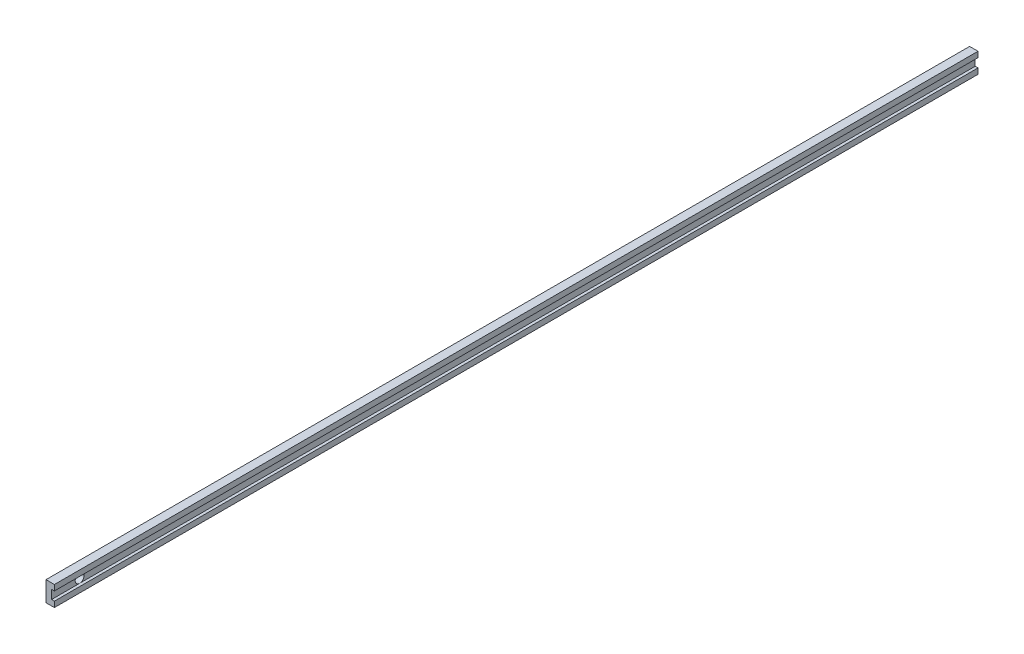
ISO-10303-21;
HEADER;
FILE_DESCRIPTION(('STEP AP214'),'2;1');
FILE_NAME('part.step','',(''),(''),'','','');
FILE_SCHEMA(('AUTOMOTIVE_DESIGN { 1 0 10303 214 1 1 1 1 }'));
ENDSEC;
DATA;
#1=APPLICATION_CONTEXT('core data for automotive mechanical design processes');
#2=APPLICATION_PROTOCOL_DEFINITION('international standard','automotive_design',2000,#1);
#3=PRODUCT_CONTEXT('',#1,'mechanical');
#4=PRODUCT('Part','Part','',(#3));
#5=PRODUCT_RELATED_PRODUCT_CATEGORY('part','',(#4));
#6=PRODUCT_DEFINITION_FORMATION('','',#4);
#7=PRODUCT_DEFINITION_CONTEXT('part definition',#1,'design');
#8=PRODUCT_DEFINITION('design','',#6,#7);
#9=PRODUCT_DEFINITION_SHAPE('','',#8);
#10=(LENGTH_UNIT() NAMED_UNIT(*) SI_UNIT(.MILLI.,.METRE.));
#11=(NAMED_UNIT(*) PLANE_ANGLE_UNIT() SI_UNIT($,.RADIAN.));
#12=(NAMED_UNIT(*) SI_UNIT($,.STERADIAN.) SOLID_ANGLE_UNIT());
#13=UNCERTAINTY_MEASURE_WITH_UNIT(LENGTH_MEASURE(1.E-05),#10,'distance_accuracy_value','');
#14=(GEOMETRIC_REPRESENTATION_CONTEXT(3) GLOBAL_UNCERTAINTY_ASSIGNED_CONTEXT((#13)) GLOBAL_UNIT_ASSIGNED_CONTEXT((#10,
#11,#12)) REPRESENTATION_CONTEXT('',''));
#15=CARTESIAN_POINT('',(0.,0.,0.));
#16=DIRECTION('',(0.,0.,1.));
#17=DIRECTION('',(1.,0.,0.));
#18=AXIS2_PLACEMENT_3D('',#15,#16,#17);
#19=CARTESIAN_POINT('',(0.,-5.31875445685762,838.2));
#20=DIRECTION('',(-1.,0.,0.));
#21=DIRECTION('',(0.,-1.,0.));
#22=AXIS2_PLACEMENT_3D('',#19,#20,#21);
#23=PLANE('',#22);
#24=DIRECTION('',(0.,0.,-1.));
#25=VECTOR('',#24,1.);
#26=CARTESIAN_POINT('',(0.,-13.3187544568576,838.2));
#27=LINE('',#26,#25);
#28=CARTESIAN_POINT('',(0.,-13.3187544568576,838.2));
#29=VERTEX_POINT('',#28);
#30=CARTESIAN_POINT('',(0.,-13.3187544568576,812.8));
#31=VERTEX_POINT('',#30);
#32=EDGE_CURVE('E131',#29,#31,#27,.T.);
#33=ORIENTED_EDGE('',*,*,#32,.T.);
#34=CARTESIAN_POINT('',(0.,-9.31875445685763,812.8));
#35=DIRECTION('',(-1.,0.,0.));
#36=DIRECTION('',(0.,-1.,0.));
#37=AXIS2_PLACEMENT_3D('',#34,#35,#36);
#38=CIRCLE('',#37,3.99999999999998);
#39=CARTESIAN_POINT('',(0.,-5.31875445685762,812.8));
#40=VERTEX_POINT('',#39);
#41=EDGE_CURVE('E11',#31,#40,#38,.T.);
#42=ORIENTED_EDGE('',*,*,#41,.T.);
#43=DIRECTION('',(0.,0.,-1.));
#44=VECTOR('',#43,1.);
#45=CARTESIAN_POINT('',(0.,-5.31875445685762,838.2));
#46=LINE('',#45,#44);
#47=CARTESIAN_POINT('',(0.,-5.31875445685762,838.2));
#48=VERTEX_POINT('',#47);
#49=EDGE_CURVE('E157',#48,#40,#46,.T.);
#50=ORIENTED_EDGE('',*,*,#49,.F.);
#51=DIRECTION('',(0.,1.,0.));
#52=VECTOR('',#51,1.);
#53=CARTESIAN_POINT('',(0.,-5.31875445685762,838.2));
#54=LINE('',#53,#52);
#55=EDGE_CURVE('E54',#29,#48,#54,.T.);
#56=ORIENTED_EDGE('',*,*,#55,.F.);
#57=EDGE_LOOP('',(#33,#42,#50,#56));
#58=FACE_BOUND('',#57,.T.);
#59=ADVANCED_FACE('F33',(#58),#23,.F.);
#60=CARTESIAN_POINT('',(2.54,-5.31875445685762,838.2));
#61=DIRECTION('',(0.,1.,0.));
#62=DIRECTION('',(0.,0.,1.));
#63=AXIS2_PLACEMENT_3D('',#60,#61,#62);
#64=PLANE('',#63);
#65=DIRECTION('',(1.,0.,0.));
#66=VECTOR('',#65,1.);
#67=CARTESIAN_POINT('',(2.54,-5.31875445685762,0.));
#68=LINE('',#67,#66);
#69=CARTESIAN_POINT('',(0.,-5.31875445685762,0.));
#70=VERTEX_POINT('',#69);
#71=CARTESIAN_POINT('',(2.54,-5.31875445685762,0.));
#72=VERTEX_POINT('',#71);
#73=EDGE_CURVE('E140',#70,#72,#68,.T.);
#74=ORIENTED_EDGE('',*,*,#73,.T.);
#75=DIRECTION('',(0.,0.,-1.));
#76=VECTOR('',#75,1.);
#77=CARTESIAN_POINT('',(2.54,-5.31875445685762,838.2));
#78=LINE('',#77,#76);
#79=CARTESIAN_POINT('',(2.54,-5.31875445685762,838.2));
#80=VERTEX_POINT('',#79);
#81=EDGE_CURVE('E170',#80,#72,#78,.T.);
#82=ORIENTED_EDGE('',*,*,#81,.F.);
#83=DIRECTION('',(1.,0.,0.));
#84=VECTOR('',#83,1.);
#85=CARTESIAN_POINT('',(2.54,-5.31875445685762,838.2));
#86=LINE('',#85,#84);
#87=EDGE_CURVE('E156',#48,#80,#86,.T.);
#88=ORIENTED_EDGE('',*,*,#87,.F.);
#89=ORIENTED_EDGE('',*,*,#49,.T.);
#90=EDGE_CURVE('E88',#40,#70,#46,.T.);
#91=ORIENTED_EDGE('',*,*,#90,.T.);
#92=EDGE_LOOP('',(#74,#82,#88,#89,#91));
#93=FACE_BOUND('',#92,.T.);
#94=ADVANCED_FACE('F35',(#93),#64,.F.);
#95=CARTESIAN_POINT('',(2.54,-0.238754456857623,838.2));
#96=DIRECTION('',(-1.,0.,0.));
#97=DIRECTION('',(0.,-1.,0.));
#98=AXIS2_PLACEMENT_3D('',#95,#96,#97);
#99=PLANE('',#98);
#100=DIRECTION('',(0.,1.,0.));
#101=VECTOR('',#100,1.);
#102=CARTESIAN_POINT('',(2.54,-0.238754456857623,0.));
#103=LINE('',#102,#101);
#104=CARTESIAN_POINT('',(2.54,-0.238754456857623,0.));
#105=VERTEX_POINT('',#104);
#106=EDGE_CURVE('E142',#72,#105,#103,.T.);
#107=ORIENTED_EDGE('',*,*,#106,.T.);
#108=DIRECTION('',(0.,0.,-1.));
#109=VECTOR('',#108,1.);
#110=CARTESIAN_POINT('',(2.54,-0.238754456857623,838.2));
#111=LINE('',#110,#109);
#112=CARTESIAN_POINT('',(2.54,-0.238754456857623,838.2));
#113=VERTEX_POINT('',#112);
#114=EDGE_CURVE('E168',#113,#105,#111,.T.);
#115=ORIENTED_EDGE('',*,*,#114,.F.);
#116=DIRECTION('',(0.,1.,0.));
#117=VECTOR('',#116,1.);
#118=CARTESIAN_POINT('',(2.54,-0.238754456857623,838.2));
#119=LINE('',#118,#117);
#120=EDGE_CURVE('E96',#80,#113,#119,.T.);
#121=ORIENTED_EDGE('',*,*,#120,.F.);
#122=ORIENTED_EDGE('',*,*,#81,.T.);
#123=EDGE_LOOP('',(#107,#115,#121,#122));
#124=FACE_BOUND('',#123,.T.);
#125=ADVANCED_FACE('F199',(#124),#99,.F.);
#126=CARTESIAN_POINT('',(-5.08,-0.23875445685762,838.2));
#127=DIRECTION('',(0.,-1.,0.));
#128=DIRECTION('',(1.,0.,0.));
#129=AXIS2_PLACEMENT_3D('',#126,#127,#128);
#130=PLANE('',#129);
#131=DIRECTION('',(-1.,0.,0.));
#132=VECTOR('',#131,1.);
#133=CARTESIAN_POINT('',(-5.08,-0.23875445685762,0.));
#134=LINE('',#133,#132);
#135=CARTESIAN_POINT('',(-5.08,-0.23875445685762,0.));
#136=VERTEX_POINT('',#135);
#137=EDGE_CURVE('E145',#105,#136,#134,.T.);
#138=ORIENTED_EDGE('',*,*,#137,.T.);
#139=DIRECTION('',(0.,0.,-1.));
#140=VECTOR('',#139,1.);
#141=CARTESIAN_POINT('',(-5.08,-0.23875445685762,838.2));
#142=LINE('',#141,#140);
#143=CARTESIAN_POINT('',(-5.08,-0.23875445685762,838.2));
#144=VERTEX_POINT('',#143);
#145=EDGE_CURVE('E165',#144,#136,#142,.T.);
#146=ORIENTED_EDGE('',*,*,#145,.F.);
#147=DIRECTION('',(-1.,0.,0.));
#148=VECTOR('',#147,1.);
#149=CARTESIAN_POINT('',(-5.08,-0.23875445685762,838.2));
#150=LINE('',#149,#148);
#151=EDGE_CURVE('E179',#113,#144,#150,.T.);
#152=ORIENTED_EDGE('',*,*,#151,.F.);
#153=ORIENTED_EDGE('',*,*,#114,.T.);
#154=EDGE_LOOP('',(#138,#146,#152,#153));
#155=FACE_BOUND('',#154,.T.);
#156=ADVANCED_FACE('F201',(#155),#130,.F.);
#157=CARTESIAN_POINT('',(-5.08,-18.3987544568576,838.2));
#158=DIRECTION('',(1.,0.,0.));
#159=DIRECTION('',(0.,1.,0.));
#160=AXIS2_PLACEMENT_3D('',#157,#158,#159);
#161=PLANE('',#160);
#162=CARTESIAN_POINT('',(-5.08,-9.31875445685763,812.8));
#163=DIRECTION('',(-1.,0.,0.));
#164=DIRECTION('',(0.,0.,1.));
#165=AXIS2_PLACEMENT_3D('',#162,#163,#164);
#166=CIRCLE('',#165,3.99999999999999);
#167=CARTESIAN_POINT('',(-5.08,-9.31875445685763,816.8));
#168=VERTEX_POINT('',#167);
#169=EDGE_CURVE('E143',#168,#168,#166,.T.);
#170=ORIENTED_EDGE('',*,*,#169,.F.);
#171=EDGE_LOOP('',(#170));
#172=FACE_BOUND('',#171,.T.);
#173=DIRECTION('',(0.,-1.,0.));
#174=VECTOR('',#173,1.);
#175=CARTESIAN_POINT('',(-5.08,-18.3987544568576,0.));
#176=LINE('',#175,#174);
#177=CARTESIAN_POINT('',(-5.08,-18.3987544568576,0.));
#178=VERTEX_POINT('',#177);
#179=EDGE_CURVE('E147',#136,#178,#176,.T.);
#180=ORIENTED_EDGE('',*,*,#179,.T.);
#181=DIRECTION('',(0.,0.,-1.));
#182=VECTOR('',#181,1.);
#183=CARTESIAN_POINT('',(-5.08,-18.3987544568576,838.2));
#184=LINE('',#183,#182);
#185=CARTESIAN_POINT('',(-5.08,-18.3987544568576,838.2));
#186=VERTEX_POINT('',#185);
#187=EDGE_CURVE('E162',#186,#178,#184,.T.);
#188=ORIENTED_EDGE('',*,*,#187,.F.);
#189=DIRECTION('',(0.,-1.,0.));
#190=VECTOR('',#189,1.);
#191=CARTESIAN_POINT('',(-5.08,-18.3987544568576,838.2));
#192=LINE('',#191,#190);
#193=EDGE_CURVE('E184',#144,#186,#192,.T.);
#194=ORIENTED_EDGE('',*,*,#193,.F.);
#195=ORIENTED_EDGE('',*,*,#145,.T.);
#196=EDGE_LOOP('',(#180,#188,#194,#195));
#197=FACE_BOUND('',#196,.T.);
#198=ADVANCED_FACE('F190',(#172,#197),#161,.F.);
#199=CARTESIAN_POINT('',(2.54,-18.3987544568576,838.2));
#200=DIRECTION('',(0.,1.,0.));
#201=DIRECTION('',(-1.,0.,0.));
#202=AXIS2_PLACEMENT_3D('',#199,#200,#201);
#203=PLANE('',#202);
#204=DIRECTION('',(1.,0.,0.));
#205=VECTOR('',#204,1.);
#206=CARTESIAN_POINT('',(2.54,-18.3987544568576,0.));
#207=LINE('',#206,#205);
#208=CARTESIAN_POINT('',(2.54,-18.3987544568576,0.));
#209=VERTEX_POINT('',#208);
#210=EDGE_CURVE('E149',#178,#209,#207,.T.);
#211=ORIENTED_EDGE('',*,*,#210,.T.);
#212=DIRECTION('',(0.,0.,-1.));
#213=VECTOR('',#212,1.);
#214=CARTESIAN_POINT('',(2.54,-18.3987544568576,838.2));
#215=LINE('',#214,#213);
#216=CARTESIAN_POINT('',(2.54,-18.3987544568576,838.2));
#217=VERTEX_POINT('',#216);
#218=EDGE_CURVE('E130',#217,#209,#215,.T.);
#219=ORIENTED_EDGE('',*,*,#218,.F.);
#220=DIRECTION('',(1.,0.,0.));
#221=VECTOR('',#220,1.);
#222=CARTESIAN_POINT('',(2.54,-18.3987544568576,838.2));
#223=LINE('',#222,#221);
#224=EDGE_CURVE('E117',#186,#217,#223,.T.);
#225=ORIENTED_EDGE('',*,*,#224,.F.);
#226=ORIENTED_EDGE('',*,*,#187,.T.);
#227=EDGE_LOOP('',(#211,#219,#225,#226));
#228=FACE_BOUND('',#227,.T.);
#229=ADVANCED_FACE('F194',(#228),#203,.F.);
#230=CARTESIAN_POINT('',(2.54,-13.3187544568576,838.2));
#231=DIRECTION('',(-1.,0.,0.));
#232=DIRECTION('',(0.,0.,1.));
#233=AXIS2_PLACEMENT_3D('',#230,#231,#232);
#234=PLANE('',#233);
#235=DIRECTION('',(0.,1.,0.));
#236=VECTOR('',#235,1.);
#237=CARTESIAN_POINT('',(2.54,-13.3187544568576,0.));
#238=LINE('',#237,#236);
#239=CARTESIAN_POINT('',(2.54,-13.3187544568576,0.));
#240=VERTEX_POINT('',#239);
#241=EDGE_CURVE('E126',#209,#240,#238,.T.);
#242=ORIENTED_EDGE('',*,*,#241,.T.);
#243=DIRECTION('',(0.,0.,-1.));
#244=VECTOR('',#243,1.);
#245=CARTESIAN_POINT('',(2.54,-13.3187544568576,838.2));
#246=LINE('',#245,#244);
#247=CARTESIAN_POINT('',(2.54,-13.3187544568576,838.2));
#248=VERTEX_POINT('',#247);
#249=EDGE_CURVE('E123',#248,#240,#246,.T.);
#250=ORIENTED_EDGE('',*,*,#249,.F.);
#251=DIRECTION('',(0.,1.,0.));
#252=VECTOR('',#251,1.);
#253=CARTESIAN_POINT('',(2.54,-13.3187544568576,838.2));
#254=LINE('',#253,#252);
#255=EDGE_CURVE('E110',#217,#248,#254,.T.);
#256=ORIENTED_EDGE('',*,*,#255,.F.);
#257=ORIENTED_EDGE('',*,*,#218,.T.);
#258=EDGE_LOOP('',(#242,#250,#256,#257));
#259=FACE_BOUND('',#258,.T.);
#260=ADVANCED_FACE('F124',(#259),#234,.F.);
#261=CARTESIAN_POINT('',(0.,-13.3187544568576,838.2));
#262=DIRECTION('',(0.,-1.,0.));
#263=DIRECTION('',(0.,0.,-1.));
#264=AXIS2_PLACEMENT_3D('',#261,#262,#263);
#265=PLANE('',#264);
#266=ORIENTED_EDGE('',*,*,#249,.T.);
#267=DIRECTION('',(-1.,0.,0.));
#268=VECTOR('',#267,1.);
#269=CARTESIAN_POINT('',(0.,-13.3187544568576,0.));
#270=LINE('',#269,#268);
#271=CARTESIAN_POINT('',(0.,-13.3187544568576,0.));
#272=VERTEX_POINT('',#271);
#273=EDGE_CURVE('E152',#240,#272,#270,.T.);
#274=ORIENTED_EDGE('',*,*,#273,.T.);
#275=EDGE_CURVE('E159',#31,#272,#27,.T.);
#276=ORIENTED_EDGE('',*,*,#275,.F.);
#277=ORIENTED_EDGE('',*,*,#32,.F.);
#278=DIRECTION('',(-1.,0.,0.));
#279=VECTOR('',#278,1.);
#280=CARTESIAN_POINT('',(0.,-13.3187544568576,838.2));
#281=LINE('',#280,#279);
#282=EDGE_CURVE('E114',#248,#29,#281,.T.);
#283=ORIENTED_EDGE('',*,*,#282,.F.);
#284=EDGE_LOOP('',(#266,#274,#276,#277,#283));
#285=FACE_BOUND('',#284,.T.);
#286=ADVANCED_FACE('F133',(#285),#265,.F.);
#287=ORIENTED_EDGE('',*,*,#90,.F.);
#288=EDGE_CURVE('E37',#40,#31,#38,.T.);
#289=ORIENTED_EDGE('',*,*,#288,.T.);
#290=ORIENTED_EDGE('',*,*,#275,.T.);
#291=DIRECTION('',(0.,1.,0.));
#292=VECTOR('',#291,1.);
#293=CARTESIAN_POINT('',(0.,-5.31875445685762,0.));
#294=LINE('',#293,#292);
#295=EDGE_CURVE('E154',#272,#70,#294,.T.);
#296=ORIENTED_EDGE('',*,*,#295,.T.);
#297=EDGE_LOOP('',(#287,#289,#290,#296));
#298=FACE_BOUND('',#297,.T.);
#299=ADVANCED_FACE('F174',(#298),#23,.F.);
#300=CARTESIAN_POINT('',(0.,0.,838.2));
#301=DIRECTION('',(0.,0.,1.));
#302=DIRECTION('',(1.,0.,0.));
#303=AXIS2_PLACEMENT_3D('',#300,#301,#302);
#304=PLANE('',#303);
#305=ORIENTED_EDGE('',*,*,#87,.T.);
#306=ORIENTED_EDGE('',*,*,#120,.T.);
#307=ORIENTED_EDGE('',*,*,#151,.T.);
#308=ORIENTED_EDGE('',*,*,#193,.T.);
#309=ORIENTED_EDGE('',*,*,#224,.T.);
#310=ORIENTED_EDGE('',*,*,#255,.T.);
#311=ORIENTED_EDGE('',*,*,#282,.T.);
#312=ORIENTED_EDGE('',*,*,#55,.T.);
#313=EDGE_LOOP('',(#305,#306,#307,#308,#309,#310,#311,#312));
#314=FACE_BOUND('',#313,.T.);
#315=ADVANCED_FACE('F112',(#314),#304,.T.);
#316=CARTESIAN_POINT('',(0.,0.,0.));
#317=DIRECTION('',(0.,0.,1.));
#318=DIRECTION('',(1.,0.,0.));
#319=AXIS2_PLACEMENT_3D('',#316,#317,#318);
#320=PLANE('',#319);
#321=ORIENTED_EDGE('',*,*,#73,.F.);
#322=ORIENTED_EDGE('',*,*,#295,.F.);
#323=ORIENTED_EDGE('',*,*,#273,.F.);
#324=ORIENTED_EDGE('',*,*,#241,.F.);
#325=ORIENTED_EDGE('',*,*,#210,.F.);
#326=ORIENTED_EDGE('',*,*,#179,.F.);
#327=ORIENTED_EDGE('',*,*,#137,.F.);
#328=ORIENTED_EDGE('',*,*,#106,.F.);
#329=EDGE_LOOP('',(#321,#322,#323,#324,#325,#326,#327,#328));
#330=FACE_BOUND('',#329,.T.);
#331=ADVANCED_FACE('F197',(#330),#320,.F.);
#332=CARTESIAN_POINT('',(-5.08,-9.31875445685763,812.8));
#333=DIRECTION('',(-1.,0.,0.));
#334=DIRECTION('',(0.,0.,1.));
#335=AXIS2_PLACEMENT_3D('',#332,#333,#334);
#336=CYLINDRICAL_SURFACE('',#335,3.99999999999998);
#337=ORIENTED_EDGE('',*,*,#169,.T.);
#338=EDGE_LOOP('',(#337));
#339=FACE_BOUND('',#338,.T.);
#340=ORIENTED_EDGE('',*,*,#288,.F.);
#341=ORIENTED_EDGE('',*,*,#41,.F.);
#342=EDGE_LOOP('',(#340,#341));
#343=FACE_BOUND('',#342,.T.);
#344=ADVANCED_FACE('F255',(#339,#343),#336,.F.);
#345=CLOSED_SHELL('',(#59,#94,#125,#156,#198,#229,#260,#286,#299,#315,#331,#344));
#346=MANIFOLD_SOLID_BREP('B2',#345);
#347=ADVANCED_BREP_SHAPE_REPRESENTATION('',(#18,#346),#14);
#348=SHAPE_DEFINITION_REPRESENTATION(#9,#347);
ENDSEC;
END-ISO-10303-21;
